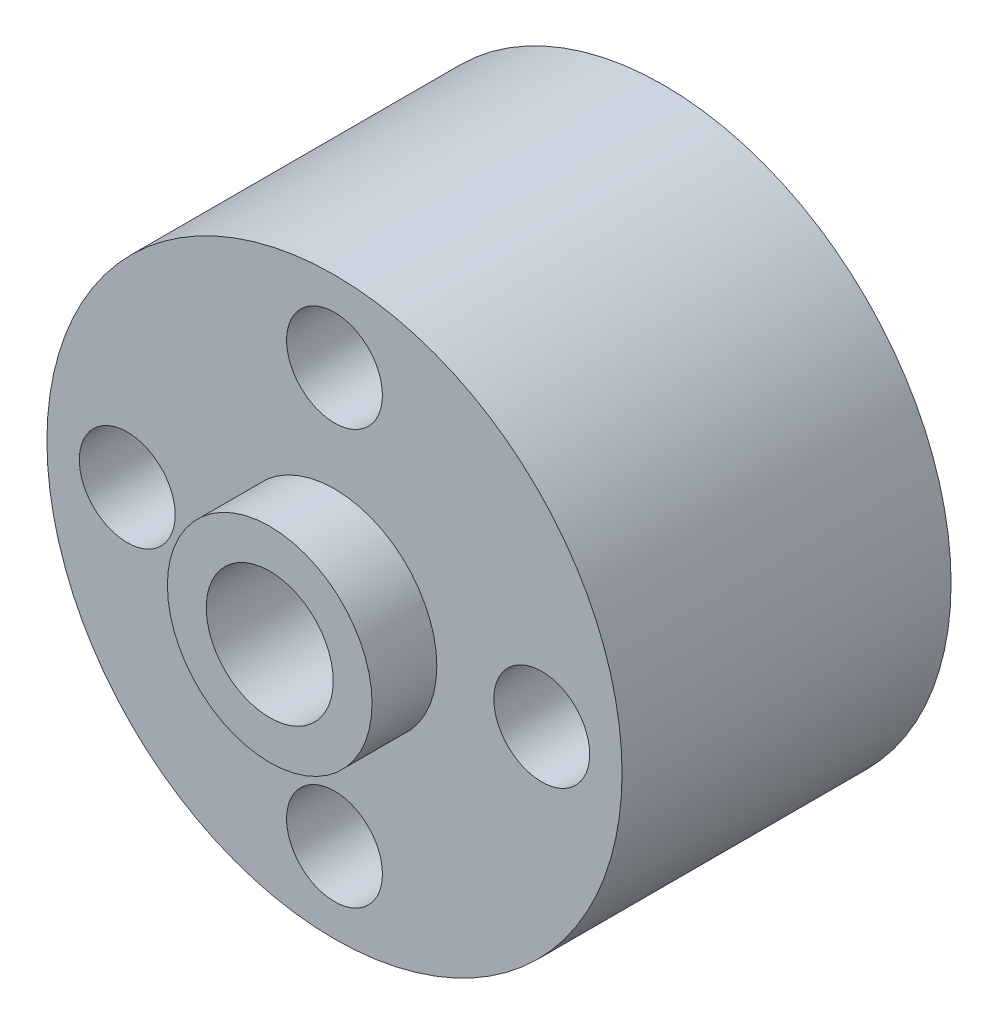
ISO-10303-21;
HEADER;
FILE_DESCRIPTION(('STEP AP214'),'2;1');
FILE_NAME('part.step','',(''),(''),'','','');
FILE_SCHEMA(('AUTOMOTIVE_DESIGN { 1 0 10303 214 1 1 1 1 }'));
ENDSEC;
DATA;
#1=APPLICATION_CONTEXT('core data for automotive mechanical design processes');
#2=APPLICATION_PROTOCOL_DEFINITION('international standard','automotive_design',2000,#1);
#3=PRODUCT_CONTEXT('',#1,'mechanical');
#4=PRODUCT('Part','Part','',(#3));
#5=PRODUCT_RELATED_PRODUCT_CATEGORY('part','',(#4));
#6=PRODUCT_DEFINITION_FORMATION('','',#4);
#7=PRODUCT_DEFINITION_CONTEXT('part definition',#1,'design');
#8=PRODUCT_DEFINITION('design','',#6,#7);
#9=PRODUCT_DEFINITION_SHAPE('','',#8);
#10=(LENGTH_UNIT() NAMED_UNIT(*) SI_UNIT(.MILLI.,.METRE.));
#11=(NAMED_UNIT(*) PLANE_ANGLE_UNIT() SI_UNIT($,.RADIAN.));
#12=(NAMED_UNIT(*) SI_UNIT($,.STERADIAN.) SOLID_ANGLE_UNIT());
#13=UNCERTAINTY_MEASURE_WITH_UNIT(LENGTH_MEASURE(1.E-05),#10,'distance_accuracy_value','');
#14=(GEOMETRIC_REPRESENTATION_CONTEXT(3) GLOBAL_UNCERTAINTY_ASSIGNED_CONTEXT((#13)) GLOBAL_UNIT_ASSIGNED_CONTEXT((#10,
#11,#12)) REPRESENTATION_CONTEXT('',''));
#15=CARTESIAN_POINT('',(0.,0.,0.));
#16=DIRECTION('',(0.,0.,1.));
#17=DIRECTION('',(1.,0.,0.));
#18=AXIS2_PLACEMENT_3D('',#15,#16,#17);
#19=CARTESIAN_POINT('',(0.,0.,-12.7));
#20=DIRECTION('',(0.,0.,1.));
#21=DIRECTION('',(1.,0.,0.));
#22=AXIS2_PLACEMENT_3D('',#19,#20,#21);
#23=PLANE('',#22);
#24=CARTESIAN_POINT('',(0.,0.,-12.7));
#25=DIRECTION('',(0.,0.,1.));
#26=DIRECTION('',(1.,0.,0.));
#27=AXIS2_PLACEMENT_3D('',#24,#25,#26);
#28=CIRCLE('',#27,11.1);
#29=CARTESIAN_POINT('',(11.1,0.,-12.7));
#30=VERTEX_POINT('',#29);
#31=EDGE_CURVE('E37',#30,#30,#28,.T.);
#32=ORIENTED_EDGE('',*,*,#31,.F.);
#33=EDGE_LOOP('',(#32));
#34=FACE_BOUND('',#33,.T.);
#35=CARTESIAN_POINT('',(8.,0.,-12.7));
#36=DIRECTION('',(0.,0.,1.));
#37=DIRECTION('',(1.,0.,0.));
#38=AXIS2_PLACEMENT_3D('',#35,#36,#37);
#39=CIRCLE('',#38,1.85);
#40=CARTESIAN_POINT('',(9.85,0.,-12.7));
#41=VERTEX_POINT('',#40);
#42=EDGE_CURVE('E46',#41,#41,#39,.T.);
#43=ORIENTED_EDGE('',*,*,#42,.T.);
#44=EDGE_LOOP('',(#43));
#45=FACE_BOUND('',#44,.T.);
#46=CARTESIAN_POINT('',(-8.,0.,-12.7));
#47=DIRECTION('',(0.,0.,1.));
#48=DIRECTION('',(1.,0.,0.));
#49=AXIS2_PLACEMENT_3D('',#46,#47,#48);
#50=CIRCLE('',#49,1.85);
#51=CARTESIAN_POINT('',(-6.15,0.,-12.7));
#52=VERTEX_POINT('',#51);
#53=EDGE_CURVE('E51',#52,#52,#50,.T.);
#54=ORIENTED_EDGE('',*,*,#53,.T.);
#55=EDGE_LOOP('',(#54));
#56=FACE_BOUND('',#55,.T.);
#57=CARTESIAN_POINT('',(0.,-8.,-12.7));
#58=DIRECTION('',(0.,0.,1.));
#59=DIRECTION('',(1.,0.,0.));
#60=AXIS2_PLACEMENT_3D('',#57,#58,#59);
#61=CIRCLE('',#60,1.85);
#62=CARTESIAN_POINT('',(1.85,-8.,-12.7));
#63=VERTEX_POINT('',#62);
#64=EDGE_CURVE('E57',#63,#63,#61,.T.);
#65=ORIENTED_EDGE('',*,*,#64,.T.);
#66=EDGE_LOOP('',(#65));
#67=FACE_BOUND('',#66,.T.);
#68=CARTESIAN_POINT('',(0.,8.,-12.7));
#69=DIRECTION('',(0.,0.,1.));
#70=DIRECTION('',(1.,0.,0.));
#71=AXIS2_PLACEMENT_3D('',#68,#69,#70);
#72=CIRCLE('',#71,1.85);
#73=CARTESIAN_POINT('',(1.85,8.,-12.7));
#74=VERTEX_POINT('',#73);
#75=EDGE_CURVE('E63',#74,#74,#72,.T.);
#76=ORIENTED_EDGE('',*,*,#75,.T.);
#77=EDGE_LOOP('',(#76));
#78=FACE_BOUND('',#77,.T.);
#79=CARTESIAN_POINT('',(0.,0.,-12.7));
#80=DIRECTION('',(0.,0.,1.));
#81=DIRECTION('',(1.,0.,0.));
#82=AXIS2_PLACEMENT_3D('',#79,#80,#81);
#83=CIRCLE('',#82,3.95);
#84=CARTESIAN_POINT('',(3.95,0.,-12.7));
#85=VERTEX_POINT('',#84);
#86=EDGE_CURVE('E10',#85,#85,#83,.F.);
#87=ORIENTED_EDGE('',*,*,#86,.F.);
#88=EDGE_LOOP('',(#87));
#89=FACE_BOUND('',#88,.T.);
#90=ADVANCED_FACE('F30',(#34,#45,#56,#67,#78,#89),#23,.F.);
#91=CARTESIAN_POINT('',(0.,0.,0.));
#92=DIRECTION('',(0.,0.,1.));
#93=DIRECTION('',(1.,0.,0.));
#94=AXIS2_PLACEMENT_3D('',#91,#92,#93);
#95=PLANE('',#94);
#96=CARTESIAN_POINT('',(0.,0.,0.));
#97=DIRECTION('',(0.,0.,1.));
#98=DIRECTION('',(1.,0.,0.));
#99=AXIS2_PLACEMENT_3D('',#96,#97,#98);
#100=CIRCLE('',#99,11.1);
#101=CARTESIAN_POINT('',(11.1,0.,0.));
#102=VERTEX_POINT('',#101);
#103=EDGE_CURVE('E41',#102,#102,#100,.T.);
#104=ORIENTED_EDGE('',*,*,#103,.T.);
#105=EDGE_LOOP('',(#104));
#106=FACE_BOUND('',#105,.T.);
#107=CARTESIAN_POINT('',(8.,0.,0.));
#108=DIRECTION('',(0.,0.,1.));
#109=DIRECTION('',(1.,0.,0.));
#110=AXIS2_PLACEMENT_3D('',#107,#108,#109);
#111=CIRCLE('',#110,1.85);
#112=CARTESIAN_POINT('',(9.85,0.,0.));
#113=VERTEX_POINT('',#112);
#114=EDGE_CURVE('E48',#113,#113,#111,.T.);
#115=ORIENTED_EDGE('',*,*,#114,.F.);
#116=EDGE_LOOP('',(#115));
#117=FACE_BOUND('',#116,.T.);
#118=CARTESIAN_POINT('',(-8.,0.,0.));
#119=DIRECTION('',(0.,0.,1.));
#120=DIRECTION('',(1.,0.,0.));
#121=AXIS2_PLACEMENT_3D('',#118,#119,#120);
#122=CIRCLE('',#121,1.85);
#123=CARTESIAN_POINT('',(-6.15,0.,0.));
#124=VERTEX_POINT('',#123);
#125=EDGE_CURVE('E54',#124,#124,#122,.T.);
#126=ORIENTED_EDGE('',*,*,#125,.F.);
#127=EDGE_LOOP('',(#126));
#128=FACE_BOUND('',#127,.T.);
#129=CARTESIAN_POINT('',(0.,-8.,0.));
#130=DIRECTION('',(0.,0.,1.));
#131=DIRECTION('',(1.,0.,0.));
#132=AXIS2_PLACEMENT_3D('',#129,#130,#131);
#133=CIRCLE('',#132,1.85);
#134=CARTESIAN_POINT('',(1.85,-8.,0.));
#135=VERTEX_POINT('',#134);
#136=EDGE_CURVE('E60',#135,#135,#133,.T.);
#137=ORIENTED_EDGE('',*,*,#136,.F.);
#138=EDGE_LOOP('',(#137));
#139=FACE_BOUND('',#138,.T.);
#140=CARTESIAN_POINT('',(0.,8.,0.));
#141=DIRECTION('',(0.,0.,1.));
#142=DIRECTION('',(1.,0.,0.));
#143=AXIS2_PLACEMENT_3D('',#140,#141,#142);
#144=CIRCLE('',#143,1.85);
#145=CARTESIAN_POINT('',(1.85,8.,0.));
#146=VERTEX_POINT('',#145);
#147=EDGE_CURVE('E66',#146,#146,#144,.T.);
#148=ORIENTED_EDGE('',*,*,#147,.F.);
#149=EDGE_LOOP('',(#148));
#150=FACE_BOUND('',#149,.T.);
#151=CARTESIAN_POINT('',(0.,0.,0.));
#152=DIRECTION('',(0.,0.,1.));
#153=DIRECTION('',(1.,0.,0.));
#154=AXIS2_PLACEMENT_3D('',#151,#152,#153);
#155=CIRCLE('',#154,3.95);
#156=CARTESIAN_POINT('',(3.95,0.,0.));
#157=VERTEX_POINT('',#156);
#158=EDGE_CURVE('E72',#157,#157,#155,.T.);
#159=ORIENTED_EDGE('',*,*,#158,.F.);
#160=EDGE_LOOP('',(#159));
#161=FACE_BOUND('',#160,.T.);
#162=ADVANCED_FACE('F110',(#106,#117,#128,#139,#150,#161),#95,.T.);
#163=CARTESIAN_POINT('',(0.,0.,-12.7));
#164=DIRECTION('',(0.,0.,1.));
#165=DIRECTION('',(1.,0.,0.));
#166=AXIS2_PLACEMENT_3D('',#163,#164,#165);
#167=CYLINDRICAL_SURFACE('',#166,11.1);
#168=ORIENTED_EDGE('',*,*,#31,.T.);
#169=EDGE_LOOP('',(#168));
#170=FACE_BOUND('',#169,.T.);
#171=ORIENTED_EDGE('',*,*,#103,.F.);
#172=EDGE_LOOP('',(#171));
#173=FACE_BOUND('',#172,.T.);
#174=ADVANCED_FACE('F32',(#170,#173),#167,.T.);
#175=CARTESIAN_POINT('',(8.,0.,-12.7));
#176=DIRECTION('',(0.,0.,1.));
#177=DIRECTION('',(1.,0.,0.));
#178=AXIS2_PLACEMENT_3D('',#175,#176,#177);
#179=CYLINDRICAL_SURFACE('',#178,1.85);
#180=ORIENTED_EDGE('',*,*,#42,.F.);
#181=EDGE_LOOP('',(#180));
#182=FACE_BOUND('',#181,.T.);
#183=ORIENTED_EDGE('',*,*,#114,.T.);
#184=EDGE_LOOP('',(#183));
#185=FACE_BOUND('',#184,.T.);
#186=ADVANCED_FACE('F117',(#182,#185),#179,.F.);
#187=CARTESIAN_POINT('',(-8.,0.,-12.7));
#188=DIRECTION('',(0.,0.,1.));
#189=DIRECTION('',(1.,0.,0.));
#190=AXIS2_PLACEMENT_3D('',#187,#188,#189);
#191=CYLINDRICAL_SURFACE('',#190,1.85);
#192=ORIENTED_EDGE('',*,*,#53,.F.);
#193=EDGE_LOOP('',(#192));
#194=FACE_BOUND('',#193,.T.);
#195=ORIENTED_EDGE('',*,*,#125,.T.);
#196=EDGE_LOOP('',(#195));
#197=FACE_BOUND('',#196,.T.);
#198=ADVANCED_FACE('F124',(#194,#197),#191,.F.);
#199=CARTESIAN_POINT('',(0.,-8.,-12.7));
#200=DIRECTION('',(0.,0.,1.));
#201=DIRECTION('',(1.,0.,0.));
#202=AXIS2_PLACEMENT_3D('',#199,#200,#201);
#203=CYLINDRICAL_SURFACE('',#202,1.85);
#204=ORIENTED_EDGE('',*,*,#64,.F.);
#205=EDGE_LOOP('',(#204));
#206=FACE_BOUND('',#205,.T.);
#207=ORIENTED_EDGE('',*,*,#136,.T.);
#208=EDGE_LOOP('',(#207));
#209=FACE_BOUND('',#208,.T.);
#210=ADVANCED_FACE('F128',(#206,#209),#203,.F.);
#211=CARTESIAN_POINT('',(0.,8.,-12.7));
#212=DIRECTION('',(0.,0.,1.));
#213=DIRECTION('',(1.,0.,0.));
#214=AXIS2_PLACEMENT_3D('',#211,#212,#213);
#215=CYLINDRICAL_SURFACE('',#214,1.85);
#216=ORIENTED_EDGE('',*,*,#75,.F.);
#217=EDGE_LOOP('',(#216));
#218=FACE_BOUND('',#217,.T.);
#219=ORIENTED_EDGE('',*,*,#147,.T.);
#220=EDGE_LOOP('',(#219));
#221=FACE_BOUND('',#220,.T.);
#222=ADVANCED_FACE('F106',(#218,#221),#215,.F.);
#223=CARTESIAN_POINT('',(0.,0.,2.5));
#224=DIRECTION('',(0.,0.,-1.));
#225=DIRECTION('',(-1.,0.,0.));
#226=AXIS2_PLACEMENT_3D('',#223,#224,#225);
#227=CYLINDRICAL_SURFACE('',#226,3.95);
#228=CARTESIAN_POINT('',(0.,0.,2.5));
#229=DIRECTION('',(0.,0.,1.));
#230=DIRECTION('',(1.,0.,0.));
#231=AXIS2_PLACEMENT_3D('',#228,#229,#230);
#232=CIRCLE('',#231,3.95);
#233=CARTESIAN_POINT('',(3.95,0.,2.5));
#234=VERTEX_POINT('',#233);
#235=EDGE_CURVE('E69',#234,#234,#232,.T.);
#236=ORIENTED_EDGE('',*,*,#235,.F.);
#237=EDGE_LOOP('',(#236));
#238=FACE_BOUND('',#237,.T.);
#239=ORIENTED_EDGE('',*,*,#158,.T.);
#240=EDGE_LOOP('',(#239));
#241=FACE_BOUND('',#240,.T.);
#242=ADVANCED_FACE('F100',(#238,#241),#227,.T.);
#243=CARTESIAN_POINT('',(0.,0.,2.5));
#244=DIRECTION('',(0.,0.,1.));
#245=DIRECTION('',(1.,0.,0.));
#246=AXIS2_PLACEMENT_3D('',#243,#244,#245);
#247=PLANE('',#246);
#248=CARTESIAN_POINT('',(0.,0.,2.5));
#249=DIRECTION('',(0.,0.,1.));
#250=DIRECTION('',(1.,0.,0.));
#251=AXIS2_PLACEMENT_3D('',#248,#249,#250);
#252=CIRCLE('',#251,2.45);
#253=CARTESIAN_POINT('',(2.45,0.,2.5));
#254=VERTEX_POINT('',#253);
#255=EDGE_CURVE('E81',#254,#254,#252,.T.);
#256=ORIENTED_EDGE('',*,*,#255,.F.);
#257=EDGE_LOOP('',(#256));
#258=FACE_BOUND('',#257,.T.);
#259=ORIENTED_EDGE('',*,*,#235,.T.);
#260=EDGE_LOOP('',(#259));
#261=FACE_BOUND('',#260,.T.);
#262=ADVANCED_FACE('F96',(#258,#261),#247,.T.);
#263=CARTESIAN_POINT('',(0.,0.,-15.2));
#264=DIRECTION('',(0.,0.,1.));
#265=DIRECTION('',(1.,0.,0.));
#266=AXIS2_PLACEMENT_3D('',#263,#264,#265);
#267=CYLINDRICAL_SURFACE('',#266,3.95);
#268=CARTESIAN_POINT('',(0.,0.,-15.2));
#269=DIRECTION('',(0.,0.,-1.));
#270=DIRECTION('',(-1.,0.,0.));
#271=AXIS2_PLACEMENT_3D('',#268,#269,#270);
#272=CIRCLE('',#271,3.95);
#273=CARTESIAN_POINT('',(-3.95,0.,-15.2));
#274=VERTEX_POINT('',#273);
#275=EDGE_CURVE('E75',#274,#274,#272,.T.);
#276=ORIENTED_EDGE('',*,*,#275,.F.);
#277=EDGE_LOOP('',(#276));
#278=FACE_BOUND('',#277,.T.);
#279=ORIENTED_EDGE('',*,*,#86,.T.);
#280=EDGE_LOOP('',(#279));
#281=FACE_BOUND('',#280,.T.);
#282=ADVANCED_FACE('F99',(#278,#281),#267,.T.);
#283=CARTESIAN_POINT('',(0.,0.,-15.2));
#284=DIRECTION('',(0.,0.,-1.));
#285=DIRECTION('',(-1.,0.,0.));
#286=AXIS2_PLACEMENT_3D('',#283,#284,#285);
#287=PLANE('',#286);
#288=CARTESIAN_POINT('',(0.,0.,-15.2));
#289=DIRECTION('',(0.,0.,1.));
#290=DIRECTION('',(1.,0.,0.));
#291=AXIS2_PLACEMENT_3D('',#288,#289,#290);
#292=CIRCLE('',#291,2.45);
#293=CARTESIAN_POINT('',(2.45,0.,-15.2));
#294=VERTEX_POINT('',#293);
#295=EDGE_CURVE('E80',#294,#294,#292,.T.);
#296=ORIENTED_EDGE('',*,*,#295,.T.);
#297=EDGE_LOOP('',(#296));
#298=FACE_BOUND('',#297,.T.);
#299=ORIENTED_EDGE('',*,*,#275,.T.);
#300=EDGE_LOOP('',(#299));
#301=FACE_BOUND('',#300,.T.);
#302=ADVANCED_FACE('F87',(#298,#301),#287,.T.);
#303=CARTESIAN_POINT('',(0.,0.,-15.2));
#304=DIRECTION('',(0.,0.,1.));
#305=DIRECTION('',(1.,0.,0.));
#306=AXIS2_PLACEMENT_3D('',#303,#304,#305);
#307=CYLINDRICAL_SURFACE('',#306,2.45);
#308=ORIENTED_EDGE('',*,*,#295,.F.);
#309=EDGE_LOOP('',(#308));
#310=FACE_BOUND('',#309,.T.);
#311=ORIENTED_EDGE('',*,*,#255,.T.);
#312=EDGE_LOOP('',(#311));
#313=FACE_BOUND('',#312,.T.);
#314=ADVANCED_FACE('F90',(#310,#313),#307,.F.);
#315=CLOSED_SHELL('',(#90,#162,#174,#186,#198,#210,#222,#242,#262,#282,#302,#314));
#316=MANIFOLD_SOLID_BREP('B2',#315);
#317=ADVANCED_BREP_SHAPE_REPRESENTATION('',(#18,#316),#14);
#318=SHAPE_DEFINITION_REPRESENTATION(#9,#317);
ENDSEC;
END-ISO-10303-21;
